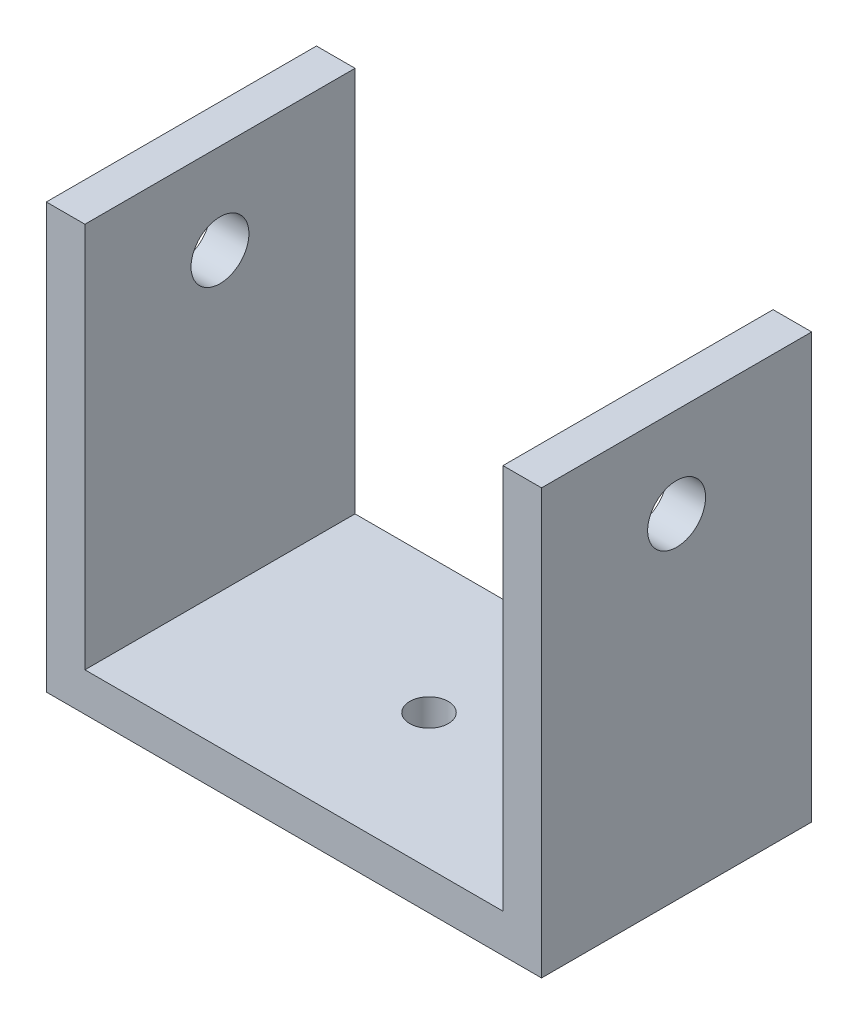
ISO-10303-21;
HEADER;
FILE_DESCRIPTION(('STEP AP214'),'2;1');
FILE_NAME('part.step','',(''),(''),'','','');
FILE_SCHEMA(('AUTOMOTIVE_DESIGN { 1 0 10303 214 1 1 1 1 }'));
ENDSEC;
DATA;
#1=APPLICATION_CONTEXT('core data for automotive mechanical design processes');
#2=APPLICATION_PROTOCOL_DEFINITION('international standard','automotive_design',2000,#1);
#3=PRODUCT_CONTEXT('',#1,'mechanical');
#4=PRODUCT('Part','Part','',(#3));
#5=PRODUCT_RELATED_PRODUCT_CATEGORY('part','',(#4));
#6=PRODUCT_DEFINITION_FORMATION('','',#4);
#7=PRODUCT_DEFINITION_CONTEXT('part definition',#1,'design');
#8=PRODUCT_DEFINITION('design','',#6,#7);
#9=PRODUCT_DEFINITION_SHAPE('','',#8);
#10=(LENGTH_UNIT() NAMED_UNIT(*) SI_UNIT(.MILLI.,.METRE.));
#11=(NAMED_UNIT(*) PLANE_ANGLE_UNIT() SI_UNIT($,.RADIAN.));
#12=(NAMED_UNIT(*) SI_UNIT($,.STERADIAN.) SOLID_ANGLE_UNIT());
#13=UNCERTAINTY_MEASURE_WITH_UNIT(LENGTH_MEASURE(1.E-05),#10,'distance_accuracy_value','');
#14=(GEOMETRIC_REPRESENTATION_CONTEXT(3) GLOBAL_UNCERTAINTY_ASSIGNED_CONTEXT((#13)) GLOBAL_UNIT_ASSIGNED_CONTEXT((#10,
#11,#12)) REPRESENTATION_CONTEXT('',''));
#15=CARTESIAN_POINT('',(0.,0.,0.));
#16=DIRECTION('',(0.,0.,1.));
#17=DIRECTION('',(1.,0.,0.));
#18=AXIS2_PLACEMENT_3D('',#15,#16,#17);
#19=CARTESIAN_POINT('',(0.,3.,10.5));
#20=DIRECTION('',(0.,0.,-1.));
#21=DIRECTION('',(-1.,0.,0.));
#22=AXIS2_PLACEMENT_3D('',#19,#20,#21);
#23=PLANE('',#22);
#24=DIRECTION('',(1.,0.,0.));
#25=VECTOR('',#24,1.);
#26=CARTESIAN_POINT('',(0.,0.,10.5));
#27=LINE('',#26,#25);
#28=CARTESIAN_POINT('',(-19.25,0.,10.5));
#29=VERTEX_POINT('',#28);
#30=CARTESIAN_POINT('',(19.25,0.,10.5));
#31=VERTEX_POINT('',#30);
#32=EDGE_CURVE('E164',#29,#31,#27,.T.);
#33=ORIENTED_EDGE('',*,*,#32,.T.);
#34=DIRECTION('',(0.,-1.,0.));
#35=VECTOR('',#34,1.);
#36=CARTESIAN_POINT('',(19.25,33.,10.5));
#37=LINE('',#36,#35);
#38=CARTESIAN_POINT('',(19.25,33.,10.5));
#39=VERTEX_POINT('',#38);
#40=EDGE_CURVE('E133',#39,#31,#37,.T.);
#41=ORIENTED_EDGE('',*,*,#40,.F.);
#42=DIRECTION('',(1.,0.,0.));
#43=VECTOR('',#42,1.);
#44=CARTESIAN_POINT('',(0.,33.,10.5));
#45=LINE('',#44,#43);
#46=CARTESIAN_POINT('',(16.25,33.,10.5));
#47=VERTEX_POINT('',#46);
#48=EDGE_CURVE('E122',#47,#39,#45,.T.);
#49=ORIENTED_EDGE('',*,*,#48,.F.);
#50=DIRECTION('',(0.,-1.,0.));
#51=VECTOR('',#50,1.);
#52=CARTESIAN_POINT('',(16.25,33.,10.5));
#53=LINE('',#52,#51);
#54=CARTESIAN_POINT('',(16.25,3.,10.5));
#55=VERTEX_POINT('',#54);
#56=EDGE_CURVE('E137',#47,#55,#53,.T.);
#57=ORIENTED_EDGE('',*,*,#56,.T.);
#58=DIRECTION('',(1.,0.,0.));
#59=VECTOR('',#58,1.);
#60=CARTESIAN_POINT('',(0.,3.,10.5));
#61=LINE('',#60,#59);
#62=CARTESIAN_POINT('',(-16.25,3.,10.5));
#63=VERTEX_POINT('',#62);
#64=EDGE_CURVE('E53',#63,#55,#61,.T.);
#65=ORIENTED_EDGE('',*,*,#64,.F.);
#66=DIRECTION('',(0.,-1.,0.));
#67=VECTOR('',#66,1.);
#68=CARTESIAN_POINT('',(-16.25,33.,10.5));
#69=LINE('',#68,#67);
#70=CARTESIAN_POINT('',(-16.25,33.,10.5));
#71=VERTEX_POINT('',#70);
#72=EDGE_CURVE('E155',#71,#63,#69,.T.);
#73=ORIENTED_EDGE('',*,*,#72,.F.);
#74=DIRECTION('',(-1.,0.,0.));
#75=VECTOR('',#74,1.);
#76=CARTESIAN_POINT('',(0.,33.,10.5));
#77=LINE('',#76,#75);
#78=CARTESIAN_POINT('',(-19.25,33.,10.5));
#79=VERTEX_POINT('',#78);
#80=EDGE_CURVE('E145',#71,#79,#77,.T.);
#81=ORIENTED_EDGE('',*,*,#80,.T.);
#82=DIRECTION('',(0.,-1.,0.));
#83=VECTOR('',#82,1.);
#84=CARTESIAN_POINT('',(-19.25,33.,10.5));
#85=LINE('',#84,#83);
#86=EDGE_CURVE('E158',#79,#29,#85,.T.);
#87=ORIENTED_EDGE('',*,*,#86,.T.);
#88=EDGE_LOOP('',(#33,#41,#49,#57,#65,#73,#81,#87));
#89=FACE_BOUND('',#88,.T.);
#90=ADVANCED_FACE('F37',(#89),#23,.F.);
#91=CARTESIAN_POINT('',(0.,3.,-10.5));
#92=DIRECTION('',(0.,0.,-1.));
#93=DIRECTION('',(-1.,0.,0.));
#94=AXIS2_PLACEMENT_3D('',#91,#92,#93);
#95=PLANE('',#94);
#96=DIRECTION('',(1.,0.,0.));
#97=VECTOR('',#96,1.);
#98=CARTESIAN_POINT('',(0.,0.,-10.5));
#99=LINE('',#98,#97);
#100=CARTESIAN_POINT('',(-19.25,0.,-10.5));
#101=VERTEX_POINT('',#100);
#102=CARTESIAN_POINT('',(19.25,0.,-10.5));
#103=VERTEX_POINT('',#102);
#104=EDGE_CURVE('E40',#101,#103,#99,.T.);
#105=ORIENTED_EDGE('',*,*,#104,.F.);
#106=DIRECTION('',(0.,-1.,0.));
#107=VECTOR('',#106,1.);
#108=CARTESIAN_POINT('',(-19.25,33.,-10.5));
#109=LINE('',#108,#107);
#110=CARTESIAN_POINT('',(-19.25,33.,-10.5));
#111=VERTEX_POINT('',#110);
#112=EDGE_CURVE('E161',#111,#101,#109,.T.);
#113=ORIENTED_EDGE('',*,*,#112,.F.);
#114=DIRECTION('',(-1.,0.,0.));
#115=VECTOR('',#114,1.);
#116=CARTESIAN_POINT('',(0.,33.,-10.5));
#117=LINE('',#116,#115);
#118=CARTESIAN_POINT('',(-16.25,33.,-10.5));
#119=VERTEX_POINT('',#118);
#120=EDGE_CURVE('E140',#119,#111,#117,.T.);
#121=ORIENTED_EDGE('',*,*,#120,.F.);
#122=DIRECTION('',(0.,-1.,0.));
#123=VECTOR('',#122,1.);
#124=CARTESIAN_POINT('',(-16.25,33.,-10.5));
#125=LINE('',#124,#123);
#126=CARTESIAN_POINT('',(-16.25,3.,-10.5));
#127=VERTEX_POINT('',#126);
#128=EDGE_CURVE('E150',#119,#127,#125,.T.);
#129=ORIENTED_EDGE('',*,*,#128,.T.);
#130=DIRECTION('',(1.,0.,0.));
#131=VECTOR('',#130,1.);
#132=CARTESIAN_POINT('',(0.,3.,-10.5));
#133=LINE('',#132,#131);
#134=CARTESIAN_POINT('',(16.25,3.,-10.5));
#135=VERTEX_POINT('',#134);
#136=EDGE_CURVE('E45',#127,#135,#133,.T.);
#137=ORIENTED_EDGE('',*,*,#136,.T.);
#138=DIRECTION('',(0.,-1.,0.));
#139=VECTOR('',#138,1.);
#140=CARTESIAN_POINT('',(16.25,33.,-10.5));
#141=LINE('',#140,#139);
#142=CARTESIAN_POINT('',(16.25,33.,-10.5));
#143=VERTEX_POINT('',#142);
#144=EDGE_CURVE('E61',#143,#135,#141,.T.);
#145=ORIENTED_EDGE('',*,*,#144,.F.);
#146=DIRECTION('',(1.,0.,0.));
#147=VECTOR('',#146,1.);
#148=CARTESIAN_POINT('',(0.,33.,-10.5));
#149=LINE('',#148,#147);
#150=CARTESIAN_POINT('',(19.25,33.,-10.5));
#151=VERTEX_POINT('',#150);
#152=EDGE_CURVE('E120',#143,#151,#149,.T.);
#153=ORIENTED_EDGE('',*,*,#152,.T.);
#154=DIRECTION('',(0.,-1.,0.));
#155=VECTOR('',#154,1.);
#156=CARTESIAN_POINT('',(19.25,33.,-10.5));
#157=LINE('',#156,#155);
#158=EDGE_CURVE('E105',#151,#103,#157,.T.);
#159=ORIENTED_EDGE('',*,*,#158,.T.);
#160=EDGE_LOOP('',(#105,#113,#121,#129,#137,#145,#153,#159));
#161=FACE_BOUND('',#160,.T.);
#162=ADVANCED_FACE('F125',(#161),#95,.T.);
#163=CARTESIAN_POINT('',(0.,3.,0.));
#164=DIRECTION('',(0.,1.,0.));
#165=DIRECTION('',(0.,0.,1.));
#166=AXIS2_PLACEMENT_3D('',#163,#164,#165);
#167=PLANE('',#166);
#168=CARTESIAN_POINT('',(0.,3.,0.));
#169=DIRECTION('',(0.,1.,0.));
#170=DIRECTION('',(0.,0.,1.));
#171=AXIS2_PLACEMENT_3D('',#168,#169,#170);
#172=CIRCLE('',#171,1.5);
#173=CARTESIAN_POINT('',(0.,3.,1.5));
#174=VERTEX_POINT('',#173);
#175=EDGE_CURVE('E233',#174,#174,#172,.T.);
#176=ORIENTED_EDGE('',*,*,#175,.F.);
#177=EDGE_LOOP('',(#176));
#178=FACE_BOUND('',#177,.T.);
#179=ORIENTED_EDGE('',*,*,#64,.T.);
#180=DIRECTION('',(0.,0.,-1.));
#181=VECTOR('',#180,1.);
#182=CARTESIAN_POINT('',(16.25,3.,0.));
#183=LINE('',#182,#181);
#184=EDGE_CURVE('E166',#55,#135,#183,.T.);
#185=ORIENTED_EDGE('',*,*,#184,.T.);
#186=ORIENTED_EDGE('',*,*,#136,.F.);
#187=DIRECTION('',(0.,0.,-1.));
#188=VECTOR('',#187,1.);
#189=CARTESIAN_POINT('',(-16.25,3.,0.));
#190=LINE('',#189,#188);
#191=EDGE_CURVE('E11',#63,#127,#190,.T.);
#192=ORIENTED_EDGE('',*,*,#191,.F.);
#193=EDGE_LOOP('',(#179,#185,#186,#192));
#194=FACE_BOUND('',#193,.T.);
#195=ADVANCED_FACE('F184',(#178,#194),#167,.T.);
#196=CARTESIAN_POINT('',(0.,0.,0.));
#197=DIRECTION('',(0.,1.,0.));
#198=DIRECTION('',(0.,0.,1.));
#199=AXIS2_PLACEMENT_3D('',#196,#197,#198);
#200=PLANE('',#199);
#201=CARTESIAN_POINT('',(0.,0.,0.));
#202=DIRECTION('',(0.,1.,0.));
#203=DIRECTION('',(0.,0.,1.));
#204=AXIS2_PLACEMENT_3D('',#201,#202,#203);
#205=CIRCLE('',#204,1.5);
#206=CARTESIAN_POINT('',(0.,0.,1.5));
#207=VERTEX_POINT('',#206);
#208=EDGE_CURVE('E230',#207,#207,#205,.T.);
#209=ORIENTED_EDGE('',*,*,#208,.T.);
#210=EDGE_LOOP('',(#209));
#211=FACE_BOUND('',#210,.T.);
#212=ORIENTED_EDGE('',*,*,#32,.F.);
#213=DIRECTION('',(0.,0.,1.));
#214=VECTOR('',#213,1.);
#215=CARTESIAN_POINT('',(-19.25,0.,0.));
#216=LINE('',#215,#214);
#217=EDGE_CURVE('E114',#101,#29,#216,.T.);
#218=ORIENTED_EDGE('',*,*,#217,.F.);
#219=ORIENTED_EDGE('',*,*,#104,.T.);
#220=DIRECTION('',(0.,0.,1.));
#221=VECTOR('',#220,1.);
#222=CARTESIAN_POINT('',(19.25,0.,0.));
#223=LINE('',#222,#221);
#224=EDGE_CURVE('E111',#103,#31,#223,.T.);
#225=ORIENTED_EDGE('',*,*,#224,.T.);
#226=EDGE_LOOP('',(#212,#218,#219,#225));
#227=FACE_BOUND('',#226,.T.);
#228=ADVANCED_FACE('F170',(#211,#227),#200,.F.);
#229=CARTESIAN_POINT('',(-16.25,33.,0.));
#230=DIRECTION('',(-1.,0.,0.));
#231=DIRECTION('',(0.,0.,1.));
#232=AXIS2_PLACEMENT_3D('',#229,#230,#231);
#233=PLANE('',#232);
#234=CARTESIAN_POINT('',(-16.25,26.,0.));
#235=DIRECTION('',(-1.,0.,0.));
#236=DIRECTION('',(0.,0.,1.));
#237=AXIS2_PLACEMENT_3D('',#234,#235,#236);
#238=CIRCLE('',#237,2.25);
#239=CARTESIAN_POINT('',(-16.25,26.,2.25));
#240=VERTEX_POINT('',#239);
#241=EDGE_CURVE('E135',#240,#240,#238,.T.);
#242=ORIENTED_EDGE('',*,*,#241,.T.);
#243=EDGE_LOOP('',(#242));
#244=FACE_BOUND('',#243,.T.);
#245=ORIENTED_EDGE('',*,*,#72,.T.);
#246=ORIENTED_EDGE('',*,*,#191,.T.);
#247=ORIENTED_EDGE('',*,*,#128,.F.);
#248=DIRECTION('',(0.,0.,-1.));
#249=VECTOR('',#248,1.);
#250=CARTESIAN_POINT('',(-16.25,33.,0.));
#251=LINE('',#250,#249);
#252=EDGE_CURVE('E148',#71,#119,#251,.T.);
#253=ORIENTED_EDGE('',*,*,#252,.F.);
#254=EDGE_LOOP('',(#245,#246,#247,#253));
#255=FACE_BOUND('',#254,.T.);
#256=ADVANCED_FACE('F182',(#244,#255),#233,.F.);
#257=CARTESIAN_POINT('',(-19.25,33.,0.));
#258=DIRECTION('',(1.,0.,0.));
#259=DIRECTION('',(0.,0.,-1.));
#260=AXIS2_PLACEMENT_3D('',#257,#258,#259);
#261=PLANE('',#260);
#262=CARTESIAN_POINT('',(-19.25,26.,0.));
#263=DIRECTION('',(1.,0.,0.));
#264=DIRECTION('',(0.,0.,-1.));
#265=AXIS2_PLACEMENT_3D('',#262,#263,#264);
#266=CIRCLE('',#265,2.25);
#267=CARTESIAN_POINT('',(-19.25,26.,-2.25));
#268=VERTEX_POINT('',#267);
#269=EDGE_CURVE('E238',#268,#268,#266,.T.);
#270=ORIENTED_EDGE('',*,*,#269,.T.);
#271=EDGE_LOOP('',(#270));
#272=FACE_BOUND('',#271,.T.);
#273=ORIENTED_EDGE('',*,*,#217,.T.);
#274=ORIENTED_EDGE('',*,*,#86,.F.);
#275=DIRECTION('',(0.,0.,1.));
#276=VECTOR('',#275,1.);
#277=CARTESIAN_POINT('',(-19.25,33.,0.));
#278=LINE('',#277,#276);
#279=EDGE_CURVE('E143',#111,#79,#278,.T.);
#280=ORIENTED_EDGE('',*,*,#279,.F.);
#281=ORIENTED_EDGE('',*,*,#112,.T.);
#282=EDGE_LOOP('',(#273,#274,#280,#281));
#283=FACE_BOUND('',#282,.T.);
#284=ADVANCED_FACE('F174',(#272,#283),#261,.F.);
#285=CARTESIAN_POINT('',(0.,33.,0.));
#286=DIRECTION('',(0.,1.,0.));
#287=DIRECTION('',(0.,0.,1.));
#288=AXIS2_PLACEMENT_3D('',#285,#286,#287);
#289=PLANE('',#288);
#290=ORIENTED_EDGE('',*,*,#120,.T.);
#291=ORIENTED_EDGE('',*,*,#279,.T.);
#292=ORIENTED_EDGE('',*,*,#80,.F.);
#293=ORIENTED_EDGE('',*,*,#252,.T.);
#294=EDGE_LOOP('',(#290,#291,#292,#293));
#295=FACE_BOUND('',#294,.T.);
#296=ADVANCED_FACE('F178',(#295),#289,.T.);
#297=CARTESIAN_POINT('',(16.25,33.,0.));
#298=DIRECTION('',(-1.,0.,0.));
#299=DIRECTION('',(0.,0.,1.));
#300=AXIS2_PLACEMENT_3D('',#297,#298,#299);
#301=PLANE('',#300);
#302=CARTESIAN_POINT('',(16.25,26.,0.));
#303=DIRECTION('',(-1.,0.,0.));
#304=DIRECTION('',(0.,0.,1.));
#305=AXIS2_PLACEMENT_3D('',#302,#303,#304);
#306=CIRCLE('',#305,2.25);
#307=CARTESIAN_POINT('',(16.25,26.,2.25));
#308=VERTEX_POINT('',#307);
#309=EDGE_CURVE('E241',#308,#308,#306,.T.);
#310=ORIENTED_EDGE('',*,*,#309,.F.);
#311=EDGE_LOOP('',(#310));
#312=FACE_BOUND('',#311,.T.);
#313=ORIENTED_EDGE('',*,*,#184,.F.);
#314=ORIENTED_EDGE('',*,*,#56,.F.);
#315=DIRECTION('',(0.,0.,-1.));
#316=VECTOR('',#315,1.);
#317=CARTESIAN_POINT('',(16.25,33.,0.));
#318=LINE('',#317,#316);
#319=EDGE_CURVE('E127',#47,#143,#318,.T.);
#320=ORIENTED_EDGE('',*,*,#319,.T.);
#321=ORIENTED_EDGE('',*,*,#144,.T.);
#322=EDGE_LOOP('',(#313,#314,#320,#321));
#323=FACE_BOUND('',#322,.T.);
#324=ADVANCED_FACE('F185',(#312,#323),#301,.T.);
#325=CARTESIAN_POINT('',(19.25,33.,0.));
#326=DIRECTION('',(1.,0.,0.));
#327=DIRECTION('',(0.,0.,-1.));
#328=AXIS2_PLACEMENT_3D('',#325,#326,#327);
#329=PLANE('',#328);
#330=CARTESIAN_POINT('',(19.25,26.,0.));
#331=DIRECTION('',(1.,0.,0.));
#332=DIRECTION('',(0.,0.,-1.));
#333=AXIS2_PLACEMENT_3D('',#330,#331,#332);
#334=CIRCLE('',#333,2.25);
#335=CARTESIAN_POINT('',(19.25,26.,-2.25));
#336=VERTEX_POINT('',#335);
#337=EDGE_CURVE('E235',#336,#336,#334,.T.);
#338=ORIENTED_EDGE('',*,*,#337,.F.);
#339=EDGE_LOOP('',(#338));
#340=FACE_BOUND('',#339,.T.);
#341=ORIENTED_EDGE('',*,*,#224,.F.);
#342=ORIENTED_EDGE('',*,*,#158,.F.);
#343=DIRECTION('',(0.,0.,1.));
#344=VECTOR('',#343,1.);
#345=CARTESIAN_POINT('',(19.25,33.,0.));
#346=LINE('',#345,#344);
#347=EDGE_CURVE('E109',#151,#39,#346,.T.);
#348=ORIENTED_EDGE('',*,*,#347,.T.);
#349=ORIENTED_EDGE('',*,*,#40,.T.);
#350=EDGE_LOOP('',(#341,#342,#348,#349));
#351=FACE_BOUND('',#350,.T.);
#352=ADVANCED_FACE('F107',(#340,#351),#329,.T.);
#353=CARTESIAN_POINT('',(0.,33.,0.));
#354=DIRECTION('',(0.,1.,0.));
#355=DIRECTION('',(0.,0.,1.));
#356=AXIS2_PLACEMENT_3D('',#353,#354,#355);
#357=PLANE('',#356);
#358=ORIENTED_EDGE('',*,*,#347,.F.);
#359=ORIENTED_EDGE('',*,*,#152,.F.);
#360=ORIENTED_EDGE('',*,*,#319,.F.);
#361=ORIENTED_EDGE('',*,*,#48,.T.);
#362=EDGE_LOOP('',(#358,#359,#360,#361));
#363=FACE_BOUND('',#362,.T.);
#364=ADVANCED_FACE('F118',(#363),#357,.T.);
#365=CARTESIAN_POINT('',(-19.25,26.,0.));
#366=DIRECTION('',(1.,0.,0.));
#367=DIRECTION('',(0.,0.,-1.));
#368=AXIS2_PLACEMENT_3D('',#365,#366,#367);
#369=CYLINDRICAL_SURFACE('',#368,2.25);
#370=ORIENTED_EDGE('',*,*,#309,.T.);
#371=EDGE_LOOP('',(#370));
#372=FACE_BOUND('',#371,.T.);
#373=ORIENTED_EDGE('',*,*,#337,.T.);
#374=EDGE_LOOP('',(#373));
#375=FACE_BOUND('',#374,.T.);
#376=ADVANCED_FACE('F215',(#372,#375),#369,.F.);
#377=ORIENTED_EDGE('',*,*,#269,.F.);
#378=EDGE_LOOP('',(#377));
#379=FACE_BOUND('',#378,.T.);
#380=ORIENTED_EDGE('',*,*,#241,.F.);
#381=EDGE_LOOP('',(#380));
#382=FACE_BOUND('',#381,.T.);
#383=ADVANCED_FACE('F218',(#379,#382),#369,.F.);
#384=CARTESIAN_POINT('',(0.,0.,0.));
#385=DIRECTION('',(0.,1.,0.));
#386=DIRECTION('',(0.,0.,1.));
#387=AXIS2_PLACEMENT_3D('',#384,#385,#386);
#388=CYLINDRICAL_SURFACE('',#387,1.5);
#389=ORIENTED_EDGE('',*,*,#208,.F.);
#390=EDGE_LOOP('',(#389));
#391=FACE_BOUND('',#390,.T.);
#392=ORIENTED_EDGE('',*,*,#175,.T.);
#393=EDGE_LOOP('',(#392));
#394=FACE_BOUND('',#393,.T.);
#395=ADVANCED_FACE('F220',(#391,#394),#388,.F.);
#396=CLOSED_SHELL('',(#90,#162,#195,#228,#256,#284,#296,#324,#352,#364,#376,#383,#395));
#397=MANIFOLD_SOLID_BREP('B2',#396);
#398=ADVANCED_BREP_SHAPE_REPRESENTATION('',(#18,#397),#14);
#399=SHAPE_DEFINITION_REPRESENTATION(#9,#398);
ENDSEC;
END-ISO-10303-21;
